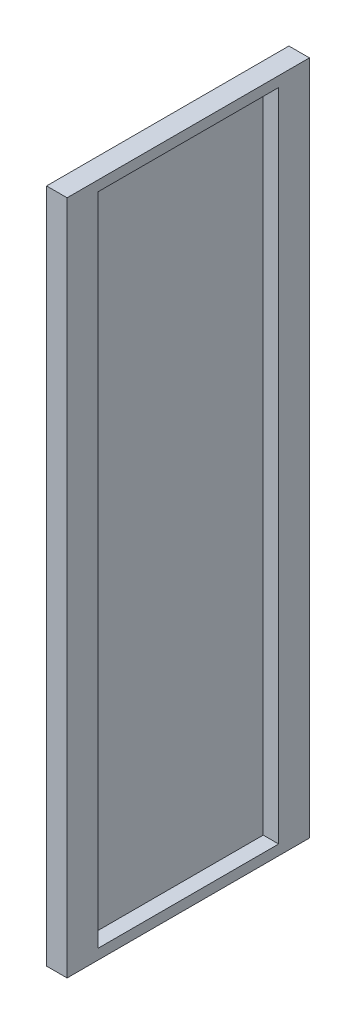
ISO-10303-21;
HEADER;
FILE_DESCRIPTION(('STEP AP214'),'2;1');
FILE_NAME('part.step','',(''),(''),'','','');
FILE_SCHEMA(('AUTOMOTIVE_DESIGN { 1 0 10303 214 1 1 1 1 }'));
ENDSEC;
DATA;
#1=APPLICATION_CONTEXT('core data for automotive mechanical design processes');
#2=APPLICATION_PROTOCOL_DEFINITION('international standard','automotive_design',2000,#1);
#3=PRODUCT_CONTEXT('',#1,'mechanical');
#4=PRODUCT('Part','Part','',(#3));
#5=PRODUCT_RELATED_PRODUCT_CATEGORY('part','',(#4));
#6=PRODUCT_DEFINITION_FORMATION('','',#4);
#7=PRODUCT_DEFINITION_CONTEXT('part definition',#1,'design');
#8=PRODUCT_DEFINITION('design','',#6,#7);
#9=PRODUCT_DEFINITION_SHAPE('','',#8);
#10=(LENGTH_UNIT() NAMED_UNIT(*) SI_UNIT(.MILLI.,.METRE.));
#11=(NAMED_UNIT(*) PLANE_ANGLE_UNIT() SI_UNIT($,.RADIAN.));
#12=(NAMED_UNIT(*) SI_UNIT($,.STERADIAN.) SOLID_ANGLE_UNIT());
#13=UNCERTAINTY_MEASURE_WITH_UNIT(LENGTH_MEASURE(1.E-05),#10,'distance_accuracy_value','');
#14=(GEOMETRIC_REPRESENTATION_CONTEXT(3) GLOBAL_UNCERTAINTY_ASSIGNED_CONTEXT((#13)) GLOBAL_UNIT_ASSIGNED_CONTEXT((#10,
#11,#12)) REPRESENTATION_CONTEXT('',''));
#15=CARTESIAN_POINT('',(0.,0.,0.));
#16=DIRECTION('',(0.,0.,1.));
#17=DIRECTION('',(1.,0.,0.));
#18=AXIS2_PLACEMENT_3D('',#15,#16,#17);
#19=CARTESIAN_POINT('',(-12.7,417.83,149.86));
#20=DIRECTION('',(1.,0.,0.));
#21=DIRECTION('',(0.,0.,-1.));
#22=AXIS2_PLACEMENT_3D('',#19,#20,#21);
#23=PLANE('',#22);
#24=DIRECTION('',(0.,0.,-1.));
#25=VECTOR('',#24,1.);
#26=CARTESIAN_POINT('',(-12.7,290.83,143.51));
#27=LINE('',#26,#25);
#28=CARTESIAN_POINT('',(-12.7,290.83,143.51));
#29=VERTEX_POINT('',#28);
#30=CARTESIAN_POINT('',(-12.7,290.83,118.11));
#31=VERTEX_POINT('',#30);
#32=EDGE_CURVE('E170',#29,#31,#27,.T.);
#33=ORIENTED_EDGE('',*,*,#32,.F.);
#34=DIRECTION('',(0.,1.,0.));
#35=VECTOR('',#34,1.);
#36=CARTESIAN_POINT('',(-12.7,172.72,143.51));
#37=LINE('',#36,#35);
#38=CARTESIAN_POINT('',(-12.7,172.72,143.51));
#39=VERTEX_POINT('',#38);
#40=EDGE_CURVE('E60',#39,#29,#37,.T.);
#41=ORIENTED_EDGE('',*,*,#40,.F.);
#42=DIRECTION('',(0.,0.,1.));
#43=VECTOR('',#42,1.);
#44=CARTESIAN_POINT('',(-12.7,172.72,143.51));
#45=LINE('',#44,#43);
#46=CARTESIAN_POINT('',(-12.7,172.72,118.11));
#47=VERTEX_POINT('',#46);
#48=EDGE_CURVE('E157',#47,#39,#45,.T.);
#49=ORIENTED_EDGE('',*,*,#48,.F.);
#50=DIRECTION('',(0.,-1.,0.));
#51=VECTOR('',#50,1.);
#52=CARTESIAN_POINT('',(-12.7,172.72,118.11));
#53=LINE('',#52,#51);
#54=EDGE_CURVE('E161',#31,#47,#53,.T.);
#55=ORIENTED_EDGE('',*,*,#54,.F.);
#56=EDGE_LOOP('',(#33,#41,#49,#55));
#57=FACE_BOUND('',#56,.T.);
#58=DIRECTION('',(0.,0.,1.));
#59=VECTOR('',#58,1.);
#60=CARTESIAN_POINT('',(-12.7,-417.83,149.86));
#61=LINE('',#60,#59);
#62=CARTESIAN_POINT('',(-12.7,-417.83,-149.86));
#63=VERTEX_POINT('',#62);
#64=CARTESIAN_POINT('',(-12.7,-417.83,149.86));
#65=VERTEX_POINT('',#64);
#66=EDGE_CURVE('E218',#63,#65,#61,.T.);
#67=ORIENTED_EDGE('',*,*,#66,.T.);
#68=DIRECTION('',(0.,-1.,0.));
#69=VECTOR('',#68,1.);
#70=CARTESIAN_POINT('',(-12.7,417.83,149.86));
#71=LINE('',#70,#69);
#72=CARTESIAN_POINT('',(-12.7,417.83,149.86));
#73=VERTEX_POINT('',#72);
#74=EDGE_CURVE('E11',#73,#65,#71,.T.);
#75=ORIENTED_EDGE('',*,*,#74,.F.);
#76=DIRECTION('',(0.,0.,1.));
#77=VECTOR('',#76,1.);
#78=CARTESIAN_POINT('',(-12.7,417.83,149.86));
#79=LINE('',#78,#77);
#80=CARTESIAN_POINT('',(-12.7,417.83,-149.86));
#81=VERTEX_POINT('',#80);
#82=EDGE_CURVE('E227',#81,#73,#79,.T.);
#83=ORIENTED_EDGE('',*,*,#82,.F.);
#84=DIRECTION('',(0.,-1.,0.));
#85=VECTOR('',#84,1.);
#86=CARTESIAN_POINT('',(-12.7,417.83,-149.86));
#87=LINE('',#86,#85);
#88=EDGE_CURVE('E241',#81,#63,#87,.T.);
#89=ORIENTED_EDGE('',*,*,#88,.T.);
#90=EDGE_LOOP('',(#67,#75,#83,#89));
#91=FACE_BOUND('',#90,.T.);
#92=ADVANCED_FACE('F45',(#57,#91),#23,.F.);
#93=CARTESIAN_POINT('',(12.7,417.83,149.86));
#94=DIRECTION('',(0.,0.,-1.));
#95=DIRECTION('',(-1.,0.,0.));
#96=AXIS2_PLACEMENT_3D('',#93,#94,#95);
#97=PLANE('',#96);
#98=DIRECTION('',(1.,0.,0.));
#99=VECTOR('',#98,1.);
#100=CARTESIAN_POINT('',(12.7,-417.83,149.86));
#101=LINE('',#100,#99);
#102=CARTESIAN_POINT('',(12.7,-417.83,149.86));
#103=VERTEX_POINT('',#102);
#104=EDGE_CURVE('E245',#65,#103,#101,.T.);
#105=ORIENTED_EDGE('',*,*,#104,.T.);
#106=DIRECTION('',(0.,-1.,0.));
#107=VECTOR('',#106,1.);
#108=CARTESIAN_POINT('',(12.7,417.83,149.86));
#109=LINE('',#108,#107);
#110=CARTESIAN_POINT('',(12.7,417.83,149.86));
#111=VERTEX_POINT('',#110);
#112=EDGE_CURVE('E53',#111,#103,#109,.T.);
#113=ORIENTED_EDGE('',*,*,#112,.F.);
#114=DIRECTION('',(1.,0.,0.));
#115=VECTOR('',#114,1.);
#116=CARTESIAN_POINT('',(12.7,417.83,149.86));
#117=LINE('',#116,#115);
#118=EDGE_CURVE('E231',#73,#111,#117,.T.);
#119=ORIENTED_EDGE('',*,*,#118,.F.);
#120=ORIENTED_EDGE('',*,*,#74,.T.);
#121=EDGE_LOOP('',(#105,#113,#119,#120));
#122=FACE_BOUND('',#121,.T.);
#123=ADVANCED_FACE('F281',(#122),#97,.F.);
#124=CARTESIAN_POINT('',(12.7,417.83,149.86));
#125=DIRECTION('',(-1.,0.,0.));
#126=DIRECTION('',(0.,0.,1.));
#127=AXIS2_PLACEMENT_3D('',#124,#125,#126);
#128=PLANE('',#127);
#129=DIRECTION('',(0.,0.,-1.));
#130=VECTOR('',#129,1.);
#131=CARTESIAN_POINT('',(12.7,-405.13,-111.76));
#132=LINE('',#131,#130);
#133=CARTESIAN_POINT('',(12.7,-405.13,111.76));
#134=VERTEX_POINT('',#133);
#135=CARTESIAN_POINT('',(12.7,-405.13,-111.76));
#136=VERTEX_POINT('',#135);
#137=EDGE_CURVE('E204',#134,#136,#132,.T.);
#138=ORIENTED_EDGE('',*,*,#137,.F.);
#139=DIRECTION('',(0.,-1.,0.));
#140=VECTOR('',#139,1.);
#141=CARTESIAN_POINT('',(12.7,-405.13,111.76));
#142=LINE('',#141,#140);
#143=CARTESIAN_POINT('',(12.7,405.13,111.76));
#144=VERTEX_POINT('',#143);
#145=EDGE_CURVE('E68',#144,#134,#142,.T.);
#146=ORIENTED_EDGE('',*,*,#145,.F.);
#147=DIRECTION('',(0.,0.,1.));
#148=VECTOR('',#147,1.);
#149=CARTESIAN_POINT('',(12.7,405.13,-111.76));
#150=LINE('',#149,#148);
#151=CARTESIAN_POINT('',(12.7,405.13,-111.76));
#152=VERTEX_POINT('',#151);
#153=EDGE_CURVE('E189',#152,#144,#150,.T.);
#154=ORIENTED_EDGE('',*,*,#153,.F.);
#155=DIRECTION('',(0.,1.,0.));
#156=VECTOR('',#155,1.);
#157=CARTESIAN_POINT('',(12.7,-405.13,-111.76));
#158=LINE('',#157,#156);
#159=EDGE_CURVE('E208',#136,#152,#158,.T.);
#160=ORIENTED_EDGE('',*,*,#159,.F.);
#161=EDGE_LOOP('',(#138,#146,#154,#160));
#162=FACE_BOUND('',#161,.T.);
#163=DIRECTION('',(0.,0.,-1.));
#164=VECTOR('',#163,1.);
#165=CARTESIAN_POINT('',(12.7,-417.83,149.86));
#166=LINE('',#165,#164);
#167=CARTESIAN_POINT('',(12.7,-417.83,-149.86));
#168=VERTEX_POINT('',#167);
#169=EDGE_CURVE('E248',#103,#168,#166,.T.);
#170=ORIENTED_EDGE('',*,*,#169,.T.);
#171=DIRECTION('',(0.,-1.,0.));
#172=VECTOR('',#171,1.);
#173=CARTESIAN_POINT('',(12.7,417.83,-149.86));
#174=LINE('',#173,#172);
#175=CARTESIAN_POINT('',(12.7,417.83,-149.86));
#176=VERTEX_POINT('',#175);
#177=EDGE_CURVE('E256',#176,#168,#174,.T.);
#178=ORIENTED_EDGE('',*,*,#177,.F.);
#179=DIRECTION('',(0.,0.,-1.));
#180=VECTOR('',#179,1.);
#181=CARTESIAN_POINT('',(12.7,417.83,149.86));
#182=LINE('',#181,#180);
#183=EDGE_CURVE('E235',#111,#176,#182,.T.);
#184=ORIENTED_EDGE('',*,*,#183,.F.);
#185=ORIENTED_EDGE('',*,*,#112,.T.);
#186=EDGE_LOOP('',(#170,#178,#184,#185));
#187=FACE_BOUND('',#186,.T.);
#188=ADVANCED_FACE('F265',(#162,#187),#128,.F.);
#189=CARTESIAN_POINT('',(12.7,417.83,-149.86));
#190=DIRECTION('',(0.,0.,1.));
#191=DIRECTION('',(1.,0.,0.));
#192=AXIS2_PLACEMENT_3D('',#189,#190,#191);
#193=PLANE('',#192);
#194=DIRECTION('',(-1.,0.,0.));
#195=VECTOR('',#194,1.);
#196=CARTESIAN_POINT('',(12.7,-417.83,-149.86));
#197=LINE('',#196,#195);
#198=EDGE_CURVE('E232',#168,#63,#197,.T.);
#199=ORIENTED_EDGE('',*,*,#198,.T.);
#200=ORIENTED_EDGE('',*,*,#88,.F.);
#201=DIRECTION('',(-1.,0.,0.));
#202=VECTOR('',#201,1.);
#203=CARTESIAN_POINT('',(12.7,417.83,-149.86));
#204=LINE('',#203,#202);
#205=EDGE_CURVE('E238',#176,#81,#204,.T.);
#206=ORIENTED_EDGE('',*,*,#205,.F.);
#207=ORIENTED_EDGE('',*,*,#177,.T.);
#208=EDGE_LOOP('',(#199,#200,#206,#207));
#209=FACE_BOUND('',#208,.T.);
#210=ADVANCED_FACE('F274',(#209),#193,.F.);
#211=CARTESIAN_POINT('',(0.,417.83,0.));
#212=DIRECTION('',(0.,1.,0.));
#213=DIRECTION('',(0.,0.,1.));
#214=AXIS2_PLACEMENT_3D('',#211,#212,#213);
#215=PLANE('',#214);
#216=ORIENTED_EDGE('',*,*,#82,.T.);
#217=ORIENTED_EDGE('',*,*,#118,.T.);
#218=ORIENTED_EDGE('',*,*,#183,.T.);
#219=ORIENTED_EDGE('',*,*,#205,.T.);
#220=EDGE_LOOP('',(#216,#217,#218,#219));
#221=FACE_BOUND('',#220,.T.);
#222=ADVANCED_FACE('F280',(#221),#215,.T.);
#223=CARTESIAN_POINT('',(0.,-417.83,0.));
#224=DIRECTION('',(0.,1.,0.));
#225=DIRECTION('',(0.,0.,1.));
#226=AXIS2_PLACEMENT_3D('',#223,#224,#225);
#227=PLANE('',#226);
#228=ORIENTED_EDGE('',*,*,#66,.F.);
#229=ORIENTED_EDGE('',*,*,#198,.F.);
#230=ORIENTED_EDGE('',*,*,#169,.F.);
#231=ORIENTED_EDGE('',*,*,#104,.F.);
#232=EDGE_LOOP('',(#228,#229,#230,#231));
#233=FACE_BOUND('',#232,.T.);
#234=ADVANCED_FACE('F271',(#233),#227,.F.);
#235=CARTESIAN_POINT('',(-6.35,-405.13,111.76));
#236=DIRECTION('',(0.,0.,1.));
#237=DIRECTION('',(1.,0.,0.));
#238=AXIS2_PLACEMENT_3D('',#235,#236,#237);
#239=PLANE('',#238);
#240=ORIENTED_EDGE('',*,*,#145,.T.);
#241=DIRECTION('',(1.,0.,0.));
#242=VECTOR('',#241,1.);
#243=CARTESIAN_POINT('',(-6.35,-405.13,111.76));
#244=LINE('',#243,#242);
#245=CARTESIAN_POINT('',(-6.35,-405.13,111.76));
#246=VERTEX_POINT('',#245);
#247=EDGE_CURVE('E201',#246,#134,#244,.T.);
#248=ORIENTED_EDGE('',*,*,#247,.F.);
#249=DIRECTION('',(0.,-1.,0.));
#250=VECTOR('',#249,1.);
#251=CARTESIAN_POINT('',(-6.35,-405.13,111.76));
#252=LINE('',#251,#250);
#253=CARTESIAN_POINT('',(-6.35,405.13,111.76));
#254=VERTEX_POINT('',#253);
#255=EDGE_CURVE('E184',#254,#246,#252,.T.);
#256=ORIENTED_EDGE('',*,*,#255,.F.);
#257=DIRECTION('',(1.,0.,0.));
#258=VECTOR('',#257,1.);
#259=CARTESIAN_POINT('',(-6.35,405.13,111.76));
#260=LINE('',#259,#258);
#261=EDGE_CURVE('E215',#254,#144,#260,.T.);
#262=ORIENTED_EDGE('',*,*,#261,.T.);
#263=EDGE_LOOP('',(#240,#248,#256,#262));
#264=FACE_BOUND('',#263,.T.);
#265=ADVANCED_FACE('F295',(#264),#239,.F.);
#266=CARTESIAN_POINT('',(-6.35,405.13,-111.76));
#267=DIRECTION('',(0.,1.,0.));
#268=DIRECTION('',(0.,0.,1.));
#269=AXIS2_PLACEMENT_3D('',#266,#267,#268);
#270=PLANE('',#269);
#271=ORIENTED_EDGE('',*,*,#153,.T.);
#272=ORIENTED_EDGE('',*,*,#261,.F.);
#273=DIRECTION('',(0.,0.,1.));
#274=VECTOR('',#273,1.);
#275=CARTESIAN_POINT('',(-6.35,405.13,-111.76));
#276=LINE('',#275,#274);
#277=CARTESIAN_POINT('',(-6.35,405.13,-111.76));
#278=VERTEX_POINT('',#277);
#279=EDGE_CURVE('E197',#278,#254,#276,.T.);
#280=ORIENTED_EDGE('',*,*,#279,.F.);
#281=DIRECTION('',(1.,0.,0.));
#282=VECTOR('',#281,1.);
#283=CARTESIAN_POINT('',(-6.35,405.13,-111.76));
#284=LINE('',#283,#282);
#285=EDGE_CURVE('E219',#278,#152,#284,.T.);
#286=ORIENTED_EDGE('',*,*,#285,.T.);
#287=EDGE_LOOP('',(#271,#272,#280,#286));
#288=FACE_BOUND('',#287,.T.);
#289=ADVANCED_FACE('F300',(#288),#270,.F.);
#290=CARTESIAN_POINT('',(-6.35,-405.13,-111.76));
#291=DIRECTION('',(0.,0.,-1.));
#292=DIRECTION('',(-1.,0.,0.));
#293=AXIS2_PLACEMENT_3D('',#290,#291,#292);
#294=PLANE('',#293);
#295=ORIENTED_EDGE('',*,*,#159,.T.);
#296=ORIENTED_EDGE('',*,*,#285,.F.);
#297=DIRECTION('',(0.,1.,0.));
#298=VECTOR('',#297,1.);
#299=CARTESIAN_POINT('',(-6.35,-405.13,-111.76));
#300=LINE('',#299,#298);
#301=CARTESIAN_POINT('',(-6.35,-405.13,-111.76));
#302=VERTEX_POINT('',#301);
#303=EDGE_CURVE('E193',#302,#278,#300,.T.);
#304=ORIENTED_EDGE('',*,*,#303,.F.);
#305=DIRECTION('',(1.,0.,0.));
#306=VECTOR('',#305,1.);
#307=CARTESIAN_POINT('',(-6.35,-405.13,-111.76));
#308=LINE('',#307,#306);
#309=EDGE_CURVE('E222',#302,#136,#308,.T.);
#310=ORIENTED_EDGE('',*,*,#309,.T.);
#311=EDGE_LOOP('',(#295,#296,#304,#310));
#312=FACE_BOUND('',#311,.T.);
#313=ADVANCED_FACE('F305',(#312),#294,.F.);
#314=CARTESIAN_POINT('',(-6.35,-405.13,-111.76));
#315=DIRECTION('',(0.,-1.,0.));
#316=DIRECTION('',(0.,0.,-1.));
#317=AXIS2_PLACEMENT_3D('',#314,#315,#316);
#318=PLANE('',#317);
#319=ORIENTED_EDGE('',*,*,#137,.T.);
#320=ORIENTED_EDGE('',*,*,#309,.F.);
#321=DIRECTION('',(0.,0.,-1.));
#322=VECTOR('',#321,1.);
#323=CARTESIAN_POINT('',(-6.35,-405.13,-111.76));
#324=LINE('',#323,#322);
#325=EDGE_CURVE('E188',#246,#302,#324,.T.);
#326=ORIENTED_EDGE('',*,*,#325,.F.);
#327=ORIENTED_EDGE('',*,*,#247,.T.);
#328=EDGE_LOOP('',(#319,#320,#326,#327));
#329=FACE_BOUND('',#328,.T.);
#330=ADVANCED_FACE('F301',(#329),#318,.F.);
#331=CARTESIAN_POINT('',(-6.35,0.,0.));
#332=DIRECTION('',(1.,0.,0.));
#333=DIRECTION('',(0.,0.,-1.));
#334=AXIS2_PLACEMENT_3D('',#331,#332,#333);
#335=PLANE('',#334);
#336=ORIENTED_EDGE('',*,*,#255,.T.);
#337=ORIENTED_EDGE('',*,*,#325,.T.);
#338=ORIENTED_EDGE('',*,*,#303,.T.);
#339=ORIENTED_EDGE('',*,*,#279,.T.);
#340=EDGE_LOOP('',(#336,#337,#338,#339));
#341=FACE_BOUND('',#340,.T.);
#342=ADVANCED_FACE('F304',(#341),#335,.T.);
#343=CARTESIAN_POINT('',(0.,172.72,143.51));
#344=DIRECTION('',(0.,0.,1.));
#345=DIRECTION('',(1.,0.,0.));
#346=AXIS2_PLACEMENT_3D('',#343,#344,#345);
#347=PLANE('',#346);
#348=ORIENTED_EDGE('',*,*,#40,.T.);
#349=DIRECTION('',(-1.,0.,0.));
#350=VECTOR('',#349,1.);
#351=CARTESIAN_POINT('',(0.,290.83,143.51));
#352=LINE('',#351,#350);
#353=CARTESIAN_POINT('',(0.,290.83,143.51));
#354=VERTEX_POINT('',#353);
#355=EDGE_CURVE('E132',#354,#29,#352,.T.);
#356=ORIENTED_EDGE('',*,*,#355,.F.);
#357=DIRECTION('',(0.,1.,0.));
#358=VECTOR('',#357,1.);
#359=CARTESIAN_POINT('',(0.,172.72,143.51));
#360=LINE('',#359,#358);
#361=CARTESIAN_POINT('',(0.,172.72,143.51));
#362=VERTEX_POINT('',#361);
#363=EDGE_CURVE('E136',#362,#354,#360,.T.);
#364=ORIENTED_EDGE('',*,*,#363,.F.);
#365=DIRECTION('',(-1.,0.,0.));
#366=VECTOR('',#365,1.);
#367=CARTESIAN_POINT('',(0.,172.72,143.51));
#368=LINE('',#367,#366);
#369=EDGE_CURVE('E176',#362,#39,#368,.T.);
#370=ORIENTED_EDGE('',*,*,#369,.T.);
#371=EDGE_LOOP('',(#348,#356,#364,#370));
#372=FACE_BOUND('',#371,.T.);
#373=ADVANCED_FACE('F134',(#372),#347,.F.);
#374=CARTESIAN_POINT('',(0.,172.72,143.51));
#375=DIRECTION('',(0.,-1.,0.));
#376=DIRECTION('',(0.,0.,-1.));
#377=AXIS2_PLACEMENT_3D('',#374,#375,#376);
#378=PLANE('',#377);
#379=ORIENTED_EDGE('',*,*,#48,.T.);
#380=ORIENTED_EDGE('',*,*,#369,.F.);
#381=DIRECTION('',(0.,0.,1.));
#382=VECTOR('',#381,1.);
#383=CARTESIAN_POINT('',(0.,172.72,143.51));
#384=LINE('',#383,#382);
#385=CARTESIAN_POINT('',(0.,172.72,118.11));
#386=VERTEX_POINT('',#385);
#387=EDGE_CURVE('E143',#386,#362,#384,.T.);
#388=ORIENTED_EDGE('',*,*,#387,.F.);
#389=DIRECTION('',(-1.,0.,0.));
#390=VECTOR('',#389,1.);
#391=CARTESIAN_POINT('',(0.,172.72,118.11));
#392=LINE('',#391,#390);
#393=EDGE_CURVE('E179',#386,#47,#392,.T.);
#394=ORIENTED_EDGE('',*,*,#393,.T.);
#395=EDGE_LOOP('',(#379,#380,#388,#394));
#396=FACE_BOUND('',#395,.T.);
#397=ADVANCED_FACE('F318',(#396),#378,.F.);
#398=CARTESIAN_POINT('',(0.,172.72,118.11));
#399=DIRECTION('',(0.,0.,-1.));
#400=DIRECTION('',(-1.,0.,0.));
#401=AXIS2_PLACEMENT_3D('',#398,#399,#400);
#402=PLANE('',#401);
#403=ORIENTED_EDGE('',*,*,#54,.T.);
#404=ORIENTED_EDGE('',*,*,#393,.F.);
#405=DIRECTION('',(0.,-1.,0.));
#406=VECTOR('',#405,1.);
#407=CARTESIAN_POINT('',(0.,172.72,118.11));
#408=LINE('',#407,#406);
#409=CARTESIAN_POINT('',(0.,290.83,118.11));
#410=VERTEX_POINT('',#409);
#411=EDGE_CURVE('E152',#410,#386,#408,.T.);
#412=ORIENTED_EDGE('',*,*,#411,.F.);
#413=DIRECTION('',(-1.,0.,0.));
#414=VECTOR('',#413,1.);
#415=CARTESIAN_POINT('',(0.,290.83,118.11));
#416=LINE('',#415,#414);
#417=EDGE_CURVE('E142',#410,#31,#416,.T.);
#418=ORIENTED_EDGE('',*,*,#417,.T.);
#419=EDGE_LOOP('',(#403,#404,#412,#418));
#420=FACE_BOUND('',#419,.T.);
#421=ADVANCED_FACE('F321',(#420),#402,.F.);
#422=CARTESIAN_POINT('',(0.,290.83,143.51));
#423=DIRECTION('',(0.,1.,0.));
#424=DIRECTION('',(0.,0.,1.));
#425=AXIS2_PLACEMENT_3D('',#422,#423,#424);
#426=PLANE('',#425);
#427=ORIENTED_EDGE('',*,*,#32,.T.);
#428=ORIENTED_EDGE('',*,*,#417,.F.);
#429=DIRECTION('',(0.,0.,-1.));
#430=VECTOR('',#429,1.);
#431=CARTESIAN_POINT('',(0.,290.83,143.51));
#432=LINE('',#431,#430);
#433=EDGE_CURVE('E146',#354,#410,#432,.T.);
#434=ORIENTED_EDGE('',*,*,#433,.F.);
#435=ORIENTED_EDGE('',*,*,#355,.T.);
#436=EDGE_LOOP('',(#427,#428,#434,#435));
#437=FACE_BOUND('',#436,.T.);
#438=ADVANCED_FACE('F147',(#437),#426,.F.);
#439=CARTESIAN_POINT('',(0.,0.,0.));
#440=DIRECTION('',(-1.,0.,0.));
#441=DIRECTION('',(0.,0.,1.));
#442=AXIS2_PLACEMENT_3D('',#439,#440,#441);
#443=PLANE('',#442);
#444=ORIENTED_EDGE('',*,*,#363,.T.);
#445=ORIENTED_EDGE('',*,*,#433,.T.);
#446=ORIENTED_EDGE('',*,*,#411,.T.);
#447=ORIENTED_EDGE('',*,*,#387,.T.);
#448=EDGE_LOOP('',(#444,#445,#446,#447));
#449=FACE_BOUND('',#448,.T.);
#450=ADVANCED_FACE('F154',(#449),#443,.T.);
#451=CLOSED_SHELL('',(#92,#123,#188,#210,#222,#234,#265,#289,#313,#330,#342,#373,#397,#421,#438,#450));
#452=MANIFOLD_SOLID_BREP('B2',#451);
#453=ADVANCED_BREP_SHAPE_REPRESENTATION('',(#18,#452),#14);
#454=SHAPE_DEFINITION_REPRESENTATION(#9,#453);
ENDSEC;
END-ISO-10303-21;
